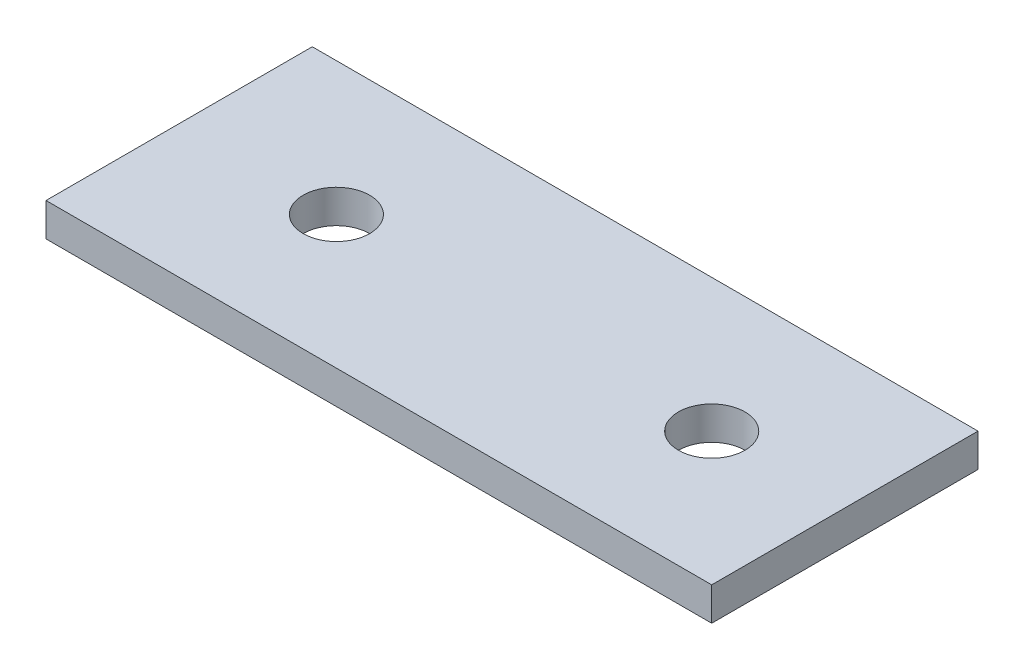
ISO-10303-21;
HEADER;
FILE_DESCRIPTION(('STEP AP214'),'2;1');
FILE_NAME('part.step','',(''),(''),'','','');
FILE_SCHEMA(('AUTOMOTIVE_DESIGN { 1 0 10303 214 1 1 1 1 }'));
ENDSEC;
DATA;
#1=APPLICATION_CONTEXT('core data for automotive mechanical design processes');
#2=APPLICATION_PROTOCOL_DEFINITION('international standard','automotive_design',2000,#1);
#3=PRODUCT_CONTEXT('',#1,'mechanical');
#4=PRODUCT('Part','Part','',(#3));
#5=PRODUCT_RELATED_PRODUCT_CATEGORY('part','',(#4));
#6=PRODUCT_DEFINITION_FORMATION('','',#4);
#7=PRODUCT_DEFINITION_CONTEXT('part definition',#1,'design');
#8=PRODUCT_DEFINITION('design','',#6,#7);
#9=PRODUCT_DEFINITION_SHAPE('','',#8);
#10=(LENGTH_UNIT() NAMED_UNIT(*) SI_UNIT(.MILLI.,.METRE.));
#11=(NAMED_UNIT(*) PLANE_ANGLE_UNIT() SI_UNIT($,.RADIAN.));
#12=(NAMED_UNIT(*) SI_UNIT($,.STERADIAN.) SOLID_ANGLE_UNIT());
#13=UNCERTAINTY_MEASURE_WITH_UNIT(LENGTH_MEASURE(1.E-05),#10,'distance_accuracy_value','');
#14=(GEOMETRIC_REPRESENTATION_CONTEXT(3) GLOBAL_UNCERTAINTY_ASSIGNED_CONTEXT((#13)) GLOBAL_UNIT_ASSIGNED_CONTEXT((#10,
#11,#12)) REPRESENTATION_CONTEXT('',''));
#15=CARTESIAN_POINT('',(0.,0.,0.));
#16=DIRECTION('',(0.,0.,1.));
#17=DIRECTION('',(1.,0.,0.));
#18=AXIS2_PLACEMENT_3D('',#15,#16,#17);
#19=CARTESIAN_POINT('',(31.75,3.175,-12.7));
#20=DIRECTION('',(-1.,0.,0.));
#21=DIRECTION('',(0.,0.,1.));
#22=AXIS2_PLACEMENT_3D('',#19,#20,#21);
#23=PLANE('',#22);
#24=DIRECTION('',(0.,0.,-1.));
#25=VECTOR('',#24,1.);
#26=CARTESIAN_POINT('',(31.75,0.,-12.7));
#27=LINE('',#26,#25);
#28=CARTESIAN_POINT('',(31.75,0.,12.7));
#29=VERTEX_POINT('',#28);
#30=CARTESIAN_POINT('',(31.75,0.,-12.7));
#31=VERTEX_POINT('',#30);
#32=EDGE_CURVE('E96',#29,#31,#27,.T.);
#33=ORIENTED_EDGE('',*,*,#32,.T.);
#34=DIRECTION('',(0.,-1.,0.));
#35=VECTOR('',#34,1.);
#36=CARTESIAN_POINT('',(31.75,3.175,-12.7));
#37=LINE('',#36,#35);
#38=CARTESIAN_POINT('',(31.75,3.175,-12.7));
#39=VERTEX_POINT('',#38);
#40=EDGE_CURVE('E11',#39,#31,#37,.T.);
#41=ORIENTED_EDGE('',*,*,#40,.F.);
#42=DIRECTION('',(0.,0.,-1.));
#43=VECTOR('',#42,1.);
#44=CARTESIAN_POINT('',(31.75,3.175,-12.7));
#45=LINE('',#44,#43);
#46=CARTESIAN_POINT('',(31.75,3.175,12.7));
#47=VERTEX_POINT('',#46);
#48=EDGE_CURVE('E84',#47,#39,#45,.T.);
#49=ORIENTED_EDGE('',*,*,#48,.F.);
#50=DIRECTION('',(0.,-1.,0.));
#51=VECTOR('',#50,1.);
#52=CARTESIAN_POINT('',(31.75,3.175,12.7));
#53=LINE('',#52,#51);
#54=EDGE_CURVE('E92',#47,#29,#53,.T.);
#55=ORIENTED_EDGE('',*,*,#54,.T.);
#56=EDGE_LOOP('',(#33,#41,#49,#55));
#57=FACE_BOUND('',#56,.T.);
#58=ADVANCED_FACE('F33',(#57),#23,.F.);
#59=CARTESIAN_POINT('',(-31.75,3.175,-12.7));
#60=DIRECTION('',(0.,0.,1.));
#61=DIRECTION('',(1.,0.,0.));
#62=AXIS2_PLACEMENT_3D('',#59,#60,#61);
#63=PLANE('',#62);
#64=DIRECTION('',(-1.,0.,0.));
#65=VECTOR('',#64,1.);
#66=CARTESIAN_POINT('',(-31.75,0.,-12.7));
#67=LINE('',#66,#65);
#68=CARTESIAN_POINT('',(-31.75,0.,-12.7));
#69=VERTEX_POINT('',#68);
#70=EDGE_CURVE('E88',#31,#69,#67,.T.);
#71=ORIENTED_EDGE('',*,*,#70,.T.);
#72=DIRECTION('',(0.,-1.,0.));
#73=VECTOR('',#72,1.);
#74=CARTESIAN_POINT('',(-31.75,3.175,-12.7));
#75=LINE('',#74,#73);
#76=CARTESIAN_POINT('',(-31.75,3.175,-12.7));
#77=VERTEX_POINT('',#76);
#78=EDGE_CURVE('E41',#77,#69,#75,.T.);
#79=ORIENTED_EDGE('',*,*,#78,.F.);
#80=DIRECTION('',(-1.,0.,0.));
#81=VECTOR('',#80,1.);
#82=CARTESIAN_POINT('',(-31.75,3.175,-12.7));
#83=LINE('',#82,#81);
#84=EDGE_CURVE('E79',#39,#77,#83,.T.);
#85=ORIENTED_EDGE('',*,*,#84,.F.);
#86=ORIENTED_EDGE('',*,*,#40,.T.);
#87=EDGE_LOOP('',(#71,#79,#85,#86));
#88=FACE_BOUND('',#87,.T.);
#89=ADVANCED_FACE('F87',(#88),#63,.F.);
#90=CARTESIAN_POINT('',(-31.75,3.175,-12.7));
#91=DIRECTION('',(1.,0.,0.));
#92=DIRECTION('',(0.,0.,-1.));
#93=AXIS2_PLACEMENT_3D('',#90,#91,#92);
#94=PLANE('',#93);
#95=DIRECTION('',(0.,0.,1.));
#96=VECTOR('',#95,1.);
#97=CARTESIAN_POINT('',(-31.75,0.,-12.7));
#98=LINE('',#97,#96);
#99=CARTESIAN_POINT('',(-31.75,0.,12.7));
#100=VERTEX_POINT('',#99);
#101=EDGE_CURVE('E66',#69,#100,#98,.T.);
#102=ORIENTED_EDGE('',*,*,#101,.T.);
#103=DIRECTION('',(0.,-1.,0.));
#104=VECTOR('',#103,1.);
#105=CARTESIAN_POINT('',(-31.75,3.175,12.7));
#106=LINE('',#105,#104);
#107=CARTESIAN_POINT('',(-31.75,3.175,12.7));
#108=VERTEX_POINT('',#107);
#109=EDGE_CURVE('E89',#108,#100,#106,.T.);
#110=ORIENTED_EDGE('',*,*,#109,.F.);
#111=DIRECTION('',(0.,0.,1.));
#112=VECTOR('',#111,1.);
#113=CARTESIAN_POINT('',(-31.75,3.175,-12.7));
#114=LINE('',#113,#112);
#115=EDGE_CURVE('E82',#77,#108,#114,.T.);
#116=ORIENTED_EDGE('',*,*,#115,.F.);
#117=ORIENTED_EDGE('',*,*,#78,.T.);
#118=EDGE_LOOP('',(#102,#110,#116,#117));
#119=FACE_BOUND('',#118,.T.);
#120=ADVANCED_FACE('F90',(#119),#94,.F.);
#121=CARTESIAN_POINT('',(-31.75,3.175,12.7));
#122=DIRECTION('',(0.,0.,-1.));
#123=DIRECTION('',(-1.,0.,0.));
#124=AXIS2_PLACEMENT_3D('',#121,#122,#123);
#125=PLANE('',#124);
#126=DIRECTION('',(1.,0.,0.));
#127=VECTOR('',#126,1.);
#128=CARTESIAN_POINT('',(-31.75,0.,12.7));
#129=LINE('',#128,#127);
#130=EDGE_CURVE('E72',#100,#29,#129,.T.);
#131=ORIENTED_EDGE('',*,*,#130,.T.);
#132=ORIENTED_EDGE('',*,*,#54,.F.);
#133=DIRECTION('',(1.,0.,0.));
#134=VECTOR('',#133,1.);
#135=CARTESIAN_POINT('',(-31.75,3.175,12.7));
#136=LINE('',#135,#134);
#137=EDGE_CURVE('E49',#108,#47,#136,.T.);
#138=ORIENTED_EDGE('',*,*,#137,.F.);
#139=ORIENTED_EDGE('',*,*,#109,.T.);
#140=EDGE_LOOP('',(#131,#132,#138,#139));
#141=FACE_BOUND('',#140,.T.);
#142=ADVANCED_FACE('F104',(#141),#125,.F.);
#143=CARTESIAN_POINT('',(0.,3.175,0.));
#144=DIRECTION('',(0.,1.,0.));
#145=DIRECTION('',(0.,0.,1.));
#146=AXIS2_PLACEMENT_3D('',#143,#144,#145);
#147=PLANE('',#146);
#148=CARTESIAN_POINT('',(19.05,3.175,0.));
#149=DIRECTION('',(0.,1.,0.));
#150=DIRECTION('',(0.,0.,1.));
#151=AXIS2_PLACEMENT_3D('',#148,#149,#150);
#152=CIRCLE('',#151,3.175);
#153=CARTESIAN_POINT('',(19.05,3.175,3.175));
#154=VERTEX_POINT('',#153);
#155=EDGE_CURVE('E118',#154,#154,#152,.T.);
#156=ORIENTED_EDGE('',*,*,#155,.F.);
#157=EDGE_LOOP('',(#156));
#158=FACE_BOUND('',#157,.T.);
#159=CARTESIAN_POINT('',(-16.75,3.175,0.));
#160=DIRECTION('',(0.,1.,0.));
#161=DIRECTION('',(0.,0.,1.));
#162=AXIS2_PLACEMENT_3D('',#159,#160,#161);
#163=CIRCLE('',#162,3.175);
#164=CARTESIAN_POINT('',(-16.75,3.175,3.175));
#165=VERTEX_POINT('',#164);
#166=EDGE_CURVE('E112',#165,#165,#163,.T.);
#167=ORIENTED_EDGE('',*,*,#166,.F.);
#168=EDGE_LOOP('',(#167));
#169=FACE_BOUND('',#168,.T.);
#170=ORIENTED_EDGE('',*,*,#48,.T.);
#171=ORIENTED_EDGE('',*,*,#84,.T.);
#172=ORIENTED_EDGE('',*,*,#115,.T.);
#173=ORIENTED_EDGE('',*,*,#137,.T.);
#174=EDGE_LOOP('',(#170,#171,#172,#173));
#175=FACE_BOUND('',#174,.T.);
#176=ADVANCED_FACE('F80',(#158,#169,#175),#147,.T.);
#177=CARTESIAN_POINT('',(0.,0.,0.));
#178=DIRECTION('',(0.,1.,0.));
#179=DIRECTION('',(0.,0.,1.));
#180=AXIS2_PLACEMENT_3D('',#177,#178,#179);
#181=PLANE('',#180);
#182=CARTESIAN_POINT('',(19.05,0.,0.));
#183=DIRECTION('',(0.,1.,0.));
#184=DIRECTION('',(0.,0.,1.));
#185=AXIS2_PLACEMENT_3D('',#182,#183,#184);
#186=CIRCLE('',#185,3.175);
#187=CARTESIAN_POINT('',(19.05,0.,3.175));
#188=VERTEX_POINT('',#187);
#189=EDGE_CURVE('E115',#188,#188,#186,.F.);
#190=ORIENTED_EDGE('',*,*,#189,.F.);
#191=EDGE_LOOP('',(#190));
#192=FACE_BOUND('',#191,.T.);
#193=CARTESIAN_POINT('',(-16.75,0.,0.));
#194=DIRECTION('',(0.,1.,0.));
#195=DIRECTION('',(0.,0.,1.));
#196=AXIS2_PLACEMENT_3D('',#193,#194,#195);
#197=CIRCLE('',#196,3.175);
#198=CARTESIAN_POINT('',(-16.75,0.,3.175));
#199=VERTEX_POINT('',#198);
#200=EDGE_CURVE('E99',#199,#199,#197,.F.);
#201=ORIENTED_EDGE('',*,*,#200,.F.);
#202=EDGE_LOOP('',(#201));
#203=FACE_BOUND('',#202,.T.);
#204=ORIENTED_EDGE('',*,*,#32,.F.);
#205=ORIENTED_EDGE('',*,*,#130,.F.);
#206=ORIENTED_EDGE('',*,*,#101,.F.);
#207=ORIENTED_EDGE('',*,*,#70,.F.);
#208=EDGE_LOOP('',(#204,#205,#206,#207));
#209=FACE_BOUND('',#208,.T.);
#210=ADVANCED_FACE('F107',(#192,#203,#209),#181,.F.);
#211=CARTESIAN_POINT('',(-16.75,-0.00100000000000013,0.));
#212=DIRECTION('',(0.,1.,0.));
#213=DIRECTION('',(0.,0.,1.));
#214=AXIS2_PLACEMENT_3D('',#211,#212,#213);
#215=CYLINDRICAL_SURFACE('',#214,3.175);
#216=ORIENTED_EDGE('',*,*,#166,.T.);
#217=EDGE_LOOP('',(#216));
#218=FACE_BOUND('',#217,.T.);
#219=ORIENTED_EDGE('',*,*,#200,.T.);
#220=EDGE_LOOP('',(#219));
#221=FACE_BOUND('',#220,.T.);
#222=ADVANCED_FACE('F130',(#218,#221),#215,.F.);
#223=CARTESIAN_POINT('',(19.05,-0.00100000000000013,0.));
#224=DIRECTION('',(0.,1.,0.));
#225=DIRECTION('',(0.,0.,1.));
#226=AXIS2_PLACEMENT_3D('',#223,#224,#225);
#227=CYLINDRICAL_SURFACE('',#226,3.175);
#228=ORIENTED_EDGE('',*,*,#155,.T.);
#229=EDGE_LOOP('',(#228));
#230=FACE_BOUND('',#229,.T.);
#231=ORIENTED_EDGE('',*,*,#189,.T.);
#232=EDGE_LOOP('',(#231));
#233=FACE_BOUND('',#232,.T.);
#234=ADVANCED_FACE('F122',(#230,#233),#227,.F.);
#235=CLOSED_SHELL('',(#58,#89,#120,#142,#176,#210,#222,#234));
#236=MANIFOLD_SOLID_BREP('B2',#235);
#237=ADVANCED_BREP_SHAPE_REPRESENTATION('',(#18,#236),#14);
#238=SHAPE_DEFINITION_REPRESENTATION(#9,#237);
ENDSEC;
END-ISO-10303-21;
